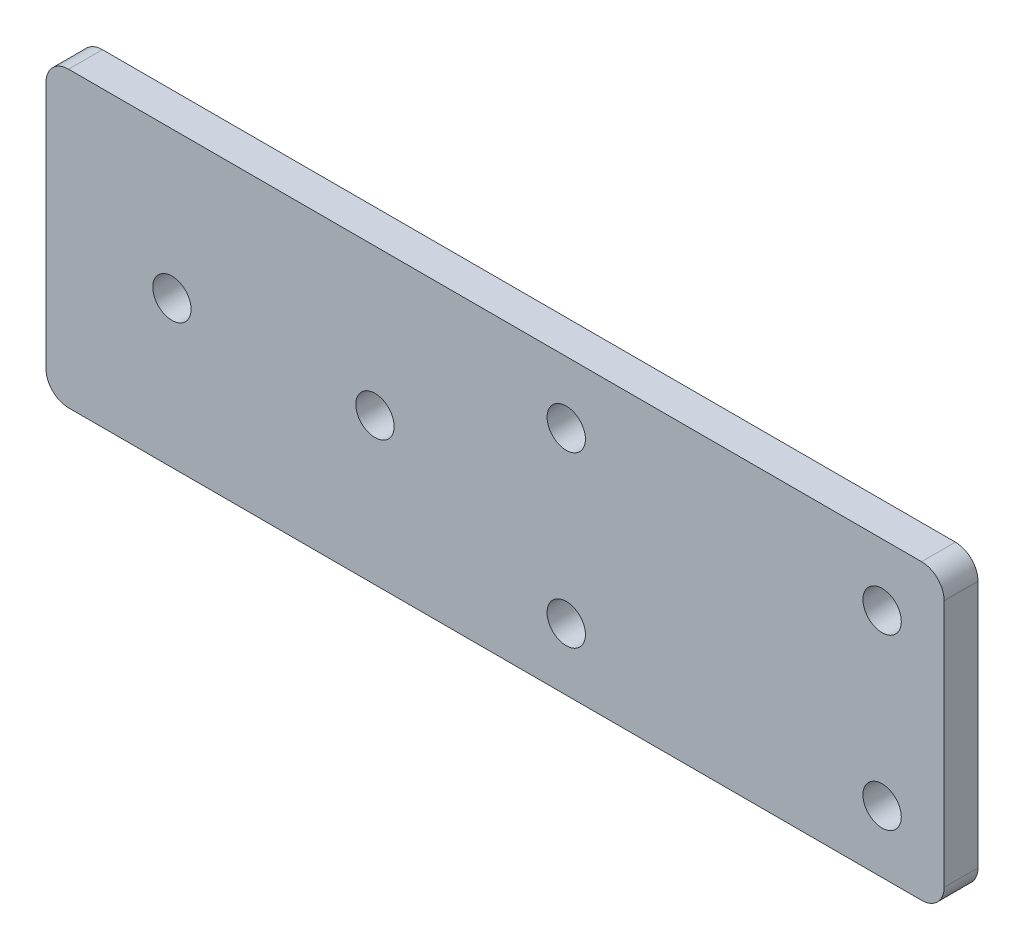
ISO-10303-21;
HEADER;
FILE_DESCRIPTION(('STEP AP214'),'2;1');
FILE_NAME('part.step','',(''),(''),'','','');
FILE_SCHEMA(('AUTOMOTIVE_DESIGN { 1 0 10303 214 1 1 1 1 }'));
ENDSEC;
DATA;
#1=APPLICATION_CONTEXT('core data for automotive mechanical design processes');
#2=APPLICATION_PROTOCOL_DEFINITION('international standard','automotive_design',2000,#1);
#3=PRODUCT_CONTEXT('',#1,'mechanical');
#4=PRODUCT('Part','Part','',(#3));
#5=PRODUCT_RELATED_PRODUCT_CATEGORY('part','',(#4));
#6=PRODUCT_DEFINITION_FORMATION('','',#4);
#7=PRODUCT_DEFINITION_CONTEXT('part definition',#1,'design');
#8=PRODUCT_DEFINITION('design','',#6,#7);
#9=PRODUCT_DEFINITION_SHAPE('','',#8);
#10=(LENGTH_UNIT() NAMED_UNIT(*) SI_UNIT(.MILLI.,.METRE.));
#11=(NAMED_UNIT(*) PLANE_ANGLE_UNIT() SI_UNIT($,.RADIAN.));
#12=(NAMED_UNIT(*) SI_UNIT($,.STERADIAN.) SOLID_ANGLE_UNIT());
#13=UNCERTAINTY_MEASURE_WITH_UNIT(LENGTH_MEASURE(1.E-05),#10,'distance_accuracy_value','');
#14=(GEOMETRIC_REPRESENTATION_CONTEXT(3) GLOBAL_UNCERTAINTY_ASSIGNED_CONTEXT((#13)) GLOBAL_UNIT_ASSIGNED_CONTEXT((#10,
#11,#12)) REPRESENTATION_CONTEXT('',''));
#15=CARTESIAN_POINT('',(0.,0.,0.));
#16=DIRECTION('',(0.,0.,1.));
#17=DIRECTION('',(1.,0.,0.));
#18=AXIS2_PLACEMENT_3D('',#15,#16,#17);
#19=CARTESIAN_POINT('',(297.881741731143,-12.9999999999997,3.));
#20=DIRECTION('',(1.,0.,0.));
#21=DIRECTION('',(0.,0.,-1.));
#22=AXIS2_PLACEMENT_3D('',#19,#20,#21);
#23=PLANE('',#22);
#24=DIRECTION('',(0.,-1.,0.));
#25=VECTOR('',#24,1.);
#26=CARTESIAN_POINT('',(297.881741731143,-12.9999999999997,0.));
#27=LINE('',#26,#25);
#28=CARTESIAN_POINT('',(297.881741731143,11.,0.));
#29=VERTEX_POINT('',#28);
#30=CARTESIAN_POINT('',(297.881741731143,-10.9999999999997,0.));
#31=VERTEX_POINT('',#30);
#32=EDGE_CURVE('E125',#29,#31,#27,.T.);
#33=ORIENTED_EDGE('',*,*,#32,.T.);
#34=DIRECTION('',(0.,0.,-1.));
#35=VECTOR('',#34,1.);
#36=CARTESIAN_POINT('',(297.881741731143,-10.9999999999997,3.));
#37=LINE('',#36,#35);
#38=CARTESIAN_POINT('',(297.881741731143,-10.9999999999997,3.));
#39=VERTEX_POINT('',#38);
#40=EDGE_CURVE('E103',#31,#39,#37,.F.);
#41=ORIENTED_EDGE('',*,*,#40,.T.);
#42=DIRECTION('',(0.,-1.,0.));
#43=VECTOR('',#42,1.);
#44=CARTESIAN_POINT('',(297.881741731143,-12.9999999999997,3.));
#45=LINE('',#44,#43);
#46=CARTESIAN_POINT('',(297.881741731143,11.,3.));
#47=VERTEX_POINT('',#46);
#48=EDGE_CURVE('E135',#47,#39,#45,.T.);
#49=ORIENTED_EDGE('',*,*,#48,.F.);
#50=DIRECTION('',(0.,0.,-1.));
#51=VECTOR('',#50,1.);
#52=CARTESIAN_POINT('',(297.881741731143,11.,3.));
#53=LINE('',#52,#51);
#54=EDGE_CURVE('E108',#47,#29,#53,.T.);
#55=ORIENTED_EDGE('',*,*,#54,.T.);
#56=EDGE_LOOP('',(#33,#41,#49,#55));
#57=FACE_BOUND('',#56,.T.);
#58=ADVANCED_FACE('F32',(#57),#23,.F.);
#59=CARTESIAN_POINT('',(297.881741731143,-12.9999999999997,3.));
#60=DIRECTION('',(0.,1.,0.));
#61=DIRECTION('',(0.,0.,1.));
#62=AXIS2_PLACEMENT_3D('',#59,#60,#61);
#63=PLANE('',#62);
#64=DIRECTION('',(1.,0.,0.));
#65=VECTOR('',#64,1.);
#66=CARTESIAN_POINT('',(297.881741731143,-12.9999999999997,3.));
#67=LINE('',#66,#65);
#68=CARTESIAN_POINT('',(299.881741731143,-12.9999999999997,3.));
#69=VERTEX_POINT('',#68);
#70=CARTESIAN_POINT('',(375.5,-12.9999999999997,3.));
#71=VERTEX_POINT('',#70);
#72=EDGE_CURVE('E118',#69,#71,#67,.T.);
#73=ORIENTED_EDGE('',*,*,#72,.F.);
#74=DIRECTION('',(0.,0.,-1.));
#75=VECTOR('',#74,1.);
#76=CARTESIAN_POINT('',(299.881741731143,-12.9999999999997,3.));
#77=LINE('',#76,#75);
#78=CARTESIAN_POINT('',(299.881741731143,-12.9999999999997,0.));
#79=VERTEX_POINT('',#78);
#80=EDGE_CURVE('E102',#69,#79,#77,.T.);
#81=ORIENTED_EDGE('',*,*,#80,.T.);
#82=DIRECTION('',(1.,0.,0.));
#83=VECTOR('',#82,1.);
#84=CARTESIAN_POINT('',(297.881741731143,-12.9999999999997,0.));
#85=LINE('',#84,#83);
#86=CARTESIAN_POINT('',(375.5,-12.9999999999997,0.));
#87=VERTEX_POINT('',#86);
#88=EDGE_CURVE('E115',#79,#87,#85,.T.);
#89=ORIENTED_EDGE('',*,*,#88,.T.);
#90=DIRECTION('',(0.,0.,-1.));
#91=VECTOR('',#90,1.);
#92=CARTESIAN_POINT('',(375.5,-12.9999999999997,3.));
#93=LINE('',#92,#91);
#94=EDGE_CURVE('E120',#87,#71,#93,.F.);
#95=ORIENTED_EDGE('',*,*,#94,.T.);
#96=EDGE_LOOP('',(#73,#81,#89,#95));
#97=FACE_BOUND('',#96,.T.);
#98=ADVANCED_FACE('F114',(#97),#63,.F.);
#99=CARTESIAN_POINT('',(377.5,-12.9999999999997,3.));
#100=DIRECTION('',(-1.,0.,0.));
#101=DIRECTION('',(0.,0.,1.));
#102=AXIS2_PLACEMENT_3D('',#99,#100,#101);
#103=PLANE('',#102);
#104=DIRECTION('',(0.,1.,0.));
#105=VECTOR('',#104,1.);
#106=CARTESIAN_POINT('',(377.5,-12.9999999999997,0.));
#107=LINE('',#106,#105);
#108=CARTESIAN_POINT('',(377.5,-10.9999999999997,0.));
#109=VERTEX_POINT('',#108);
#110=CARTESIAN_POINT('',(377.5,11.,0.));
#111=VERTEX_POINT('',#110);
#112=EDGE_CURVE('E124',#109,#111,#107,.T.);
#113=ORIENTED_EDGE('',*,*,#112,.T.);
#114=DIRECTION('',(0.,0.,-1.));
#115=VECTOR('',#114,1.);
#116=CARTESIAN_POINT('',(377.5,11.,3.));
#117=LINE('',#116,#115);
#118=CARTESIAN_POINT('',(377.5,11.,3.));
#119=VERTEX_POINT('',#118);
#120=EDGE_CURVE('E11',#111,#119,#117,.F.);
#121=ORIENTED_EDGE('',*,*,#120,.T.);
#122=DIRECTION('',(0.,1.,0.));
#123=VECTOR('',#122,1.);
#124=CARTESIAN_POINT('',(377.5,-12.9999999999997,3.));
#125=LINE('',#124,#123);
#126=CARTESIAN_POINT('',(377.5,-10.9999999999997,3.));
#127=VERTEX_POINT('',#126);
#128=EDGE_CURVE('E174',#127,#119,#125,.T.);
#129=ORIENTED_EDGE('',*,*,#128,.F.);
#130=DIRECTION('',(0.,0.,-1.));
#131=VECTOR('',#130,1.);
#132=CARTESIAN_POINT('',(377.5,-10.9999999999997,3.));
#133=LINE('',#132,#131);
#134=EDGE_CURVE('E40',#127,#109,#133,.T.);
#135=ORIENTED_EDGE('',*,*,#134,.T.);
#136=EDGE_LOOP('',(#113,#121,#129,#135));
#137=FACE_BOUND('',#136,.T.);
#138=ADVANCED_FACE('F172',(#137),#103,.F.);
#139=CARTESIAN_POINT('',(297.881741731143,13.,3.));
#140=DIRECTION('',(0.,-1.,0.));
#141=DIRECTION('',(0.,0.,-1.));
#142=AXIS2_PLACEMENT_3D('',#139,#140,#141);
#143=PLANE('',#142);
#144=DIRECTION('',(-1.,0.,0.));
#145=VECTOR('',#144,1.);
#146=CARTESIAN_POINT('',(297.881741731143,13.,0.));
#147=LINE('',#146,#145);
#148=CARTESIAN_POINT('',(375.5,13.,0.));
#149=VERTEX_POINT('',#148);
#150=CARTESIAN_POINT('',(299.881741731143,13.,0.));
#151=VERTEX_POINT('',#150);
#152=EDGE_CURVE('E128',#149,#151,#147,.T.);
#153=ORIENTED_EDGE('',*,*,#152,.T.);
#154=DIRECTION('',(0.,0.,-1.));
#155=VECTOR('',#154,1.);
#156=CARTESIAN_POINT('',(299.881741731143,13.,3.));
#157=LINE('',#156,#155);
#158=CARTESIAN_POINT('',(299.881741731143,13.,3.));
#159=VERTEX_POINT('',#158);
#160=EDGE_CURVE('E47',#151,#159,#157,.F.);
#161=ORIENTED_EDGE('',*,*,#160,.T.);
#162=DIRECTION('',(-1.,0.,0.));
#163=VECTOR('',#162,1.);
#164=CARTESIAN_POINT('',(297.881741731143,13.,3.));
#165=LINE('',#164,#163);
#166=CARTESIAN_POINT('',(375.5,13.,3.));
#167=VERTEX_POINT('',#166);
#168=EDGE_CURVE('E149',#167,#159,#165,.T.);
#169=ORIENTED_EDGE('',*,*,#168,.F.);
#170=DIRECTION('',(0.,0.,-1.));
#171=VECTOR('',#170,1.);
#172=CARTESIAN_POINT('',(375.5,13.,3.));
#173=LINE('',#172,#171);
#174=EDGE_CURVE('E165',#167,#149,#173,.T.);
#175=ORIENTED_EDGE('',*,*,#174,.T.);
#176=EDGE_LOOP('',(#153,#161,#169,#175));
#177=FACE_BOUND('',#176,.T.);
#178=ADVANCED_FACE('F181',(#177),#143,.F.);
#179=CARTESIAN_POINT('',(0.,0.,3.));
#180=DIRECTION('',(0.,0.,-1.));
#181=DIRECTION('',(-1.,0.,0.));
#182=AXIS2_PLACEMENT_3D('',#179,#180,#181);
#183=PLANE('',#182);
#184=CARTESIAN_POINT('',(309.046054969375,0.,3.));
#185=DIRECTION('',(0.,0.,1.));
#186=DIRECTION('',(1.,0.,0.));
#187=AXIS2_PLACEMENT_3D('',#184,#185,#186);
#188=CIRCLE('',#187,1.69999999999998);
#189=CARTESIAN_POINT('',(310.746054969375,0.,3.));
#190=VERTEX_POINT('',#189);
#191=EDGE_CURVE('E207',#190,#190,#188,.T.);
#192=ORIENTED_EDGE('',*,*,#191,.F.);
#193=EDGE_LOOP('',(#192));
#194=FACE_BOUND('',#193,.T.);
#195=CARTESIAN_POINT('',(327.046054969375,0.,3.));
#196=DIRECTION('',(0.,0.,1.));
#197=DIRECTION('',(1.,0.,0.));
#198=AXIS2_PLACEMENT_3D('',#195,#196,#197);
#199=CIRCLE('',#198,1.69999999999998);
#200=CARTESIAN_POINT('',(328.746054969375,0.,3.));
#201=VERTEX_POINT('',#200);
#202=EDGE_CURVE('E201',#201,#201,#199,.T.);
#203=ORIENTED_EDGE('',*,*,#202,.F.);
#204=EDGE_LOOP('',(#203));
#205=FACE_BOUND('',#204,.T.);
#206=CARTESIAN_POINT('',(372.,-7.50000000000002,3.));
#207=DIRECTION('',(0.,0.,1.));
#208=DIRECTION('',(1.,0.,0.));
#209=AXIS2_PLACEMENT_3D('',#206,#207,#208);
#210=CIRCLE('',#209,1.69999999999998);
#211=CARTESIAN_POINT('',(373.7,-7.50000000000002,3.));
#212=VERTEX_POINT('',#211);
#213=EDGE_CURVE('E148',#212,#212,#210,.T.);
#214=ORIENTED_EDGE('',*,*,#213,.F.);
#215=EDGE_LOOP('',(#214));
#216=FACE_BOUND('',#215,.T.);
#217=CARTESIAN_POINT('',(372.,7.49999999999998,3.));
#218=DIRECTION('',(0.,0.,1.));
#219=DIRECTION('',(1.,0.,0.));
#220=AXIS2_PLACEMENT_3D('',#217,#218,#219);
#221=CIRCLE('',#220,1.69999999999998);
#222=CARTESIAN_POINT('',(373.7,7.49999999999998,3.));
#223=VERTEX_POINT('',#222);
#224=EDGE_CURVE('E144',#223,#223,#221,.T.);
#225=ORIENTED_EDGE('',*,*,#224,.F.);
#226=EDGE_LOOP('',(#225));
#227=FACE_BOUND('',#226,.T.);
#228=CARTESIAN_POINT('',(344.,7.49999999999998,3.));
#229=DIRECTION('',(0.,0.,1.));
#230=DIRECTION('',(1.,0.,0.));
#231=AXIS2_PLACEMENT_3D('',#228,#229,#230);
#232=CIRCLE('',#231,1.69999999999998);
#233=CARTESIAN_POINT('',(345.7,7.49999999999998,3.));
#234=VERTEX_POINT('',#233);
#235=EDGE_CURVE('E140',#234,#234,#232,.T.);
#236=ORIENTED_EDGE('',*,*,#235,.F.);
#237=EDGE_LOOP('',(#236));
#238=FACE_BOUND('',#237,.T.);
#239=CARTESIAN_POINT('',(344.,-7.50000000000002,3.));
#240=DIRECTION('',(0.,0.,1.));
#241=DIRECTION('',(1.,0.,0.));
#242=AXIS2_PLACEMENT_3D('',#239,#240,#241);
#243=CIRCLE('',#242,1.69999999999998);
#244=CARTESIAN_POINT('',(345.7,-7.50000000000002,3.));
#245=VERTEX_POINT('',#244);
#246=EDGE_CURVE('E139',#245,#245,#243,.T.);
#247=ORIENTED_EDGE('',*,*,#246,.F.);
#248=EDGE_LOOP('',(#247));
#249=FACE_BOUND('',#248,.T.);
#250=ORIENTED_EDGE('',*,*,#48,.T.);
#251=CARTESIAN_POINT('',(299.881741731143,-10.9999999999997,3.));
#252=DIRECTION('',(0.,0.,-1.));
#253=DIRECTION('',(-1.,0.,0.));
#254=AXIS2_PLACEMENT_3D('',#251,#252,#253);
#255=CIRCLE('',#254,2.);
#256=EDGE_CURVE('E163',#39,#69,#255,.F.);
#257=ORIENTED_EDGE('',*,*,#256,.T.);
#258=ORIENTED_EDGE('',*,*,#72,.T.);
#259=CARTESIAN_POINT('',(375.5,-10.9999999999997,3.));
#260=DIRECTION('',(0.,0.,-1.));
#261=DIRECTION('',(-1.,0.,0.));
#262=AXIS2_PLACEMENT_3D('',#259,#260,#261);
#263=CIRCLE('',#262,2.);
#264=EDGE_CURVE('E158',#71,#127,#263,.F.);
#265=ORIENTED_EDGE('',*,*,#264,.T.);
#266=ORIENTED_EDGE('',*,*,#128,.T.);
#267=CARTESIAN_POINT('',(375.5,11.,3.));
#268=DIRECTION('',(0.,0.,-1.));
#269=DIRECTION('',(-1.,0.,0.));
#270=AXIS2_PLACEMENT_3D('',#267,#268,#269);
#271=CIRCLE('',#270,2.);
#272=EDGE_CURVE('E54',#119,#167,#271,.F.);
#273=ORIENTED_EDGE('',*,*,#272,.T.);
#274=ORIENTED_EDGE('',*,*,#168,.T.);
#275=CARTESIAN_POINT('',(299.881741731143,11.,3.));
#276=DIRECTION('',(0.,0.,-1.));
#277=DIRECTION('',(-1.,0.,0.));
#278=AXIS2_PLACEMENT_3D('',#275,#276,#277);
#279=CIRCLE('',#278,2.);
#280=EDGE_CURVE('E161',#159,#47,#279,.F.);
#281=ORIENTED_EDGE('',*,*,#280,.T.);
#282=EDGE_LOOP('',(#250,#257,#258,#265,#266,#273,#274,#281));
#283=FACE_BOUND('',#282,.T.);
#284=ADVANCED_FACE('F213',(#194,#205,#216,#227,#238,#249,#283),#183,.F.);
#285=CARTESIAN_POINT('',(0.,0.,0.));
#286=DIRECTION('',(0.,0.,-1.));
#287=DIRECTION('',(-1.,0.,0.));
#288=AXIS2_PLACEMENT_3D('',#285,#286,#287);
#289=PLANE('',#288);
#290=CARTESIAN_POINT('',(309.046054969375,0.,0.));
#291=DIRECTION('',(0.,0.,-1.));
#292=DIRECTION('',(-1.,0.,0.));
#293=AXIS2_PLACEMENT_3D('',#290,#291,#292);
#294=CIRCLE('',#293,1.69999999999998);
#295=CARTESIAN_POINT('',(307.346054969375,0.,0.));
#296=VERTEX_POINT('',#295);
#297=EDGE_CURVE('E204',#296,#296,#294,.T.);
#298=ORIENTED_EDGE('',*,*,#297,.F.);
#299=EDGE_LOOP('',(#298));
#300=FACE_BOUND('',#299,.T.);
#301=CARTESIAN_POINT('',(327.046054969375,0.,0.));
#302=DIRECTION('',(0.,0.,-1.));
#303=DIRECTION('',(-1.,0.,0.));
#304=AXIS2_PLACEMENT_3D('',#301,#302,#303);
#305=CIRCLE('',#304,1.69999999999998);
#306=CARTESIAN_POINT('',(325.346054969375,0.,0.));
#307=VERTEX_POINT('',#306);
#308=EDGE_CURVE('E198',#307,#307,#305,.T.);
#309=ORIENTED_EDGE('',*,*,#308,.F.);
#310=EDGE_LOOP('',(#309));
#311=FACE_BOUND('',#310,.T.);
#312=CARTESIAN_POINT('',(372.,-7.50000000000002,0.));
#313=DIRECTION('',(0.,0.,-1.));
#314=DIRECTION('',(-1.,0.,0.));
#315=AXIS2_PLACEMENT_3D('',#312,#313,#314);
#316=CIRCLE('',#315,1.69999999999998);
#317=CARTESIAN_POINT('',(370.3,-7.50000000000002,0.));
#318=VERTEX_POINT('',#317);
#319=EDGE_CURVE('E145',#318,#318,#316,.T.);
#320=ORIENTED_EDGE('',*,*,#319,.F.);
#321=EDGE_LOOP('',(#320));
#322=FACE_BOUND('',#321,.T.);
#323=CARTESIAN_POINT('',(372.,7.49999999999998,0.));
#324=DIRECTION('',(0.,0.,-1.));
#325=DIRECTION('',(-1.,0.,0.));
#326=AXIS2_PLACEMENT_3D('',#323,#324,#325);
#327=CIRCLE('',#326,1.69999999999998);
#328=CARTESIAN_POINT('',(370.3,7.49999999999998,0.));
#329=VERTEX_POINT('',#328);
#330=EDGE_CURVE('E141',#329,#329,#327,.T.);
#331=ORIENTED_EDGE('',*,*,#330,.F.);
#332=EDGE_LOOP('',(#331));
#333=FACE_BOUND('',#332,.T.);
#334=CARTESIAN_POINT('',(344.,7.49999999999998,0.));
#335=DIRECTION('',(0.,0.,-1.));
#336=DIRECTION('',(-1.,0.,0.));
#337=AXIS2_PLACEMENT_3D('',#334,#335,#336);
#338=CIRCLE('',#337,1.69999999999998);
#339=CARTESIAN_POINT('',(342.3,7.49999999999998,0.));
#340=VERTEX_POINT('',#339);
#341=EDGE_CURVE('E136',#340,#340,#338,.T.);
#342=ORIENTED_EDGE('',*,*,#341,.F.);
#343=EDGE_LOOP('',(#342));
#344=FACE_BOUND('',#343,.T.);
#345=CARTESIAN_POINT('',(344.,-7.50000000000002,0.));
#346=DIRECTION('',(0.,0.,-1.));
#347=DIRECTION('',(-1.,0.,0.));
#348=AXIS2_PLACEMENT_3D('',#345,#346,#347);
#349=CIRCLE('',#348,1.69999999999998);
#350=CARTESIAN_POINT('',(342.3,-7.50000000000002,0.));
#351=VERTEX_POINT('',#350);
#352=EDGE_CURVE('E130',#351,#351,#349,.T.);
#353=ORIENTED_EDGE('',*,*,#352,.F.);
#354=EDGE_LOOP('',(#353));
#355=FACE_BOUND('',#354,.T.);
#356=ORIENTED_EDGE('',*,*,#88,.F.);
#357=CARTESIAN_POINT('',(299.881741731143,-10.9999999999997,0.));
#358=DIRECTION('',(0.,0.,-1.));
#359=DIRECTION('',(-1.,0.,0.));
#360=AXIS2_PLACEMENT_3D('',#357,#358,#359);
#361=CIRCLE('',#360,2.);
#362=EDGE_CURVE('E98',#79,#31,#361,.T.);
#363=ORIENTED_EDGE('',*,*,#362,.T.);
#364=ORIENTED_EDGE('',*,*,#32,.F.);
#365=CARTESIAN_POINT('',(299.881741731143,11.,0.));
#366=DIRECTION('',(0.,0.,-1.));
#367=DIRECTION('',(-1.,0.,0.));
#368=AXIS2_PLACEMENT_3D('',#365,#366,#367);
#369=CIRCLE('',#368,2.);
#370=EDGE_CURVE('E109',#29,#151,#369,.T.);
#371=ORIENTED_EDGE('',*,*,#370,.T.);
#372=ORIENTED_EDGE('',*,*,#152,.F.);
#373=CARTESIAN_POINT('',(375.5,11.,0.));
#374=DIRECTION('',(0.,0.,-1.));
#375=DIRECTION('',(-1.,0.,0.));
#376=AXIS2_PLACEMENT_3D('',#373,#374,#375);
#377=CIRCLE('',#376,2.);
#378=EDGE_CURVE('E152',#149,#111,#377,.T.);
#379=ORIENTED_EDGE('',*,*,#378,.T.);
#380=ORIENTED_EDGE('',*,*,#112,.F.);
#381=CARTESIAN_POINT('',(375.5,-10.9999999999997,0.));
#382=DIRECTION('',(0.,0.,-1.));
#383=DIRECTION('',(-1.,0.,0.));
#384=AXIS2_PLACEMENT_3D('',#381,#382,#383);
#385=CIRCLE('',#384,2.);
#386=EDGE_CURVE('E119',#109,#87,#385,.T.);
#387=ORIENTED_EDGE('',*,*,#386,.T.);
#388=EDGE_LOOP('',(#356,#363,#364,#371,#372,#379,#380,#387));
#389=FACE_BOUND('',#388,.T.);
#390=ADVANCED_FACE('F122',(#300,#311,#322,#333,#344,#355,#389),#289,.T.);
#391=CARTESIAN_POINT('',(344.,-7.50000000000002,3.));
#392=DIRECTION('',(0.,0.,1.));
#393=DIRECTION('',(1.,0.,0.));
#394=AXIS2_PLACEMENT_3D('',#391,#392,#393);
#395=CYLINDRICAL_SURFACE('',#394,1.69999999999998);
#396=ORIENTED_EDGE('',*,*,#352,.T.);
#397=EDGE_LOOP('',(#396));
#398=FACE_BOUND('',#397,.T.);
#399=ORIENTED_EDGE('',*,*,#246,.T.);
#400=EDGE_LOOP('',(#399));
#401=FACE_BOUND('',#400,.T.);
#402=ADVANCED_FACE('F250',(#398,#401),#395,.F.);
#403=CARTESIAN_POINT('',(344.,7.49999999999998,3.));
#404=DIRECTION('',(0.,0.,1.));
#405=DIRECTION('',(1.,0.,0.));
#406=AXIS2_PLACEMENT_3D('',#403,#404,#405);
#407=CYLINDRICAL_SURFACE('',#406,1.69999999999998);
#408=ORIENTED_EDGE('',*,*,#341,.T.);
#409=EDGE_LOOP('',(#408));
#410=FACE_BOUND('',#409,.T.);
#411=ORIENTED_EDGE('',*,*,#235,.T.);
#412=EDGE_LOOP('',(#411));
#413=FACE_BOUND('',#412,.T.);
#414=ADVANCED_FACE('F255',(#410,#413),#407,.F.);
#415=CARTESIAN_POINT('',(372.,7.49999999999998,3.));
#416=DIRECTION('',(0.,0.,1.));
#417=DIRECTION('',(1.,0.,0.));
#418=AXIS2_PLACEMENT_3D('',#415,#416,#417);
#419=CYLINDRICAL_SURFACE('',#418,1.69999999999998);
#420=ORIENTED_EDGE('',*,*,#330,.T.);
#421=EDGE_LOOP('',(#420));
#422=FACE_BOUND('',#421,.T.);
#423=ORIENTED_EDGE('',*,*,#224,.T.);
#424=EDGE_LOOP('',(#423));
#425=FACE_BOUND('',#424,.T.);
#426=ADVANCED_FACE('F259',(#422,#425),#419,.F.);
#427=CARTESIAN_POINT('',(372.,-7.50000000000002,3.));
#428=DIRECTION('',(0.,0.,1.));
#429=DIRECTION('',(1.,0.,0.));
#430=AXIS2_PLACEMENT_3D('',#427,#428,#429);
#431=CYLINDRICAL_SURFACE('',#430,1.69999999999998);
#432=ORIENTED_EDGE('',*,*,#319,.T.);
#433=EDGE_LOOP('',(#432));
#434=FACE_BOUND('',#433,.T.);
#435=ORIENTED_EDGE('',*,*,#213,.T.);
#436=EDGE_LOOP('',(#435));
#437=FACE_BOUND('',#436,.T.);
#438=ADVANCED_FACE('F263',(#434,#437),#431,.F.);
#439=CARTESIAN_POINT('',(327.046054969375,0.,3.));
#440=DIRECTION('',(0.,0.,1.));
#441=DIRECTION('',(1.,0.,0.));
#442=AXIS2_PLACEMENT_3D('',#439,#440,#441);
#443=CYLINDRICAL_SURFACE('',#442,1.69999999999998);
#444=ORIENTED_EDGE('',*,*,#308,.T.);
#445=EDGE_LOOP('',(#444));
#446=FACE_BOUND('',#445,.T.);
#447=ORIENTED_EDGE('',*,*,#202,.T.);
#448=EDGE_LOOP('',(#447));
#449=FACE_BOUND('',#448,.T.);
#450=ADVANCED_FACE('F267',(#446,#449),#443,.F.);
#451=CARTESIAN_POINT('',(309.046054969375,0.,3.));
#452=DIRECTION('',(0.,0.,1.));
#453=DIRECTION('',(1.,0.,0.));
#454=AXIS2_PLACEMENT_3D('',#451,#452,#453);
#455=CYLINDRICAL_SURFACE('',#454,1.69999999999998);
#456=ORIENTED_EDGE('',*,*,#297,.T.);
#457=EDGE_LOOP('',(#456));
#458=FACE_BOUND('',#457,.T.);
#459=ORIENTED_EDGE('',*,*,#191,.T.);
#460=EDGE_LOOP('',(#459));
#461=FACE_BOUND('',#460,.T.);
#462=ADVANCED_FACE('F211',(#458,#461),#455,.F.);
#463=CARTESIAN_POINT('',(299.881741731143,-10.9999999999997,3.));
#464=DIRECTION('',(0.,0.,-1.));
#465=DIRECTION('',(-1.,0.,0.));
#466=AXIS2_PLACEMENT_3D('',#463,#464,#465);
#467=CYLINDRICAL_SURFACE('',#466,2.);
#468=ORIENTED_EDGE('',*,*,#256,.F.);
#469=ORIENTED_EDGE('',*,*,#40,.F.);
#470=ORIENTED_EDGE('',*,*,#362,.F.);
#471=ORIENTED_EDGE('',*,*,#80,.F.);
#472=EDGE_LOOP('',(#468,#469,#470,#471));
#473=FACE_BOUND('',#472,.T.);
#474=ADVANCED_FACE('F101',(#473),#467,.T.);
#475=CARTESIAN_POINT('',(299.881741731143,11.,3.));
#476=DIRECTION('',(0.,0.,-1.));
#477=DIRECTION('',(-1.,0.,0.));
#478=AXIS2_PLACEMENT_3D('',#475,#476,#477);
#479=CYLINDRICAL_SURFACE('',#478,2.);
#480=ORIENTED_EDGE('',*,*,#280,.F.);
#481=ORIENTED_EDGE('',*,*,#160,.F.);
#482=ORIENTED_EDGE('',*,*,#370,.F.);
#483=ORIENTED_EDGE('',*,*,#54,.F.);
#484=EDGE_LOOP('',(#480,#481,#482,#483));
#485=FACE_BOUND('',#484,.T.);
#486=ADVANCED_FACE('F230',(#485),#479,.T.);
#487=CARTESIAN_POINT('',(375.5,11.,3.));
#488=DIRECTION('',(0.,0.,-1.));
#489=DIRECTION('',(-1.,0.,0.));
#490=AXIS2_PLACEMENT_3D('',#487,#488,#489);
#491=CYLINDRICAL_SURFACE('',#490,2.);
#492=ORIENTED_EDGE('',*,*,#272,.F.);
#493=ORIENTED_EDGE('',*,*,#120,.F.);
#494=ORIENTED_EDGE('',*,*,#378,.F.);
#495=ORIENTED_EDGE('',*,*,#174,.F.);
#496=EDGE_LOOP('',(#492,#493,#494,#495));
#497=FACE_BOUND('',#496,.T.);
#498=ADVANCED_FACE('F180',(#497),#491,.T.);
#499=CARTESIAN_POINT('',(375.5,-10.9999999999997,3.));
#500=DIRECTION('',(0.,0.,-1.));
#501=DIRECTION('',(-1.,0.,0.));
#502=AXIS2_PLACEMENT_3D('',#499,#500,#501);
#503=CYLINDRICAL_SURFACE('',#502,2.);
#504=ORIENTED_EDGE('',*,*,#264,.F.);
#505=ORIENTED_EDGE('',*,*,#94,.F.);
#506=ORIENTED_EDGE('',*,*,#386,.F.);
#507=ORIENTED_EDGE('',*,*,#134,.F.);
#508=EDGE_LOOP('',(#504,#505,#506,#507));
#509=FACE_BOUND('',#508,.T.);
#510=ADVANCED_FACE('F34',(#509),#503,.T.);
#511=CLOSED_SHELL('',(#58,#98,#138,#178,#284,#390,#402,#414,#426,#438,#450,#462,#474,#486,#498,#510));
#512=MANIFOLD_SOLID_BREP('B2',#511);
#513=ADVANCED_BREP_SHAPE_REPRESENTATION('',(#18,#512),#14);
#514=SHAPE_DEFINITION_REPRESENTATION(#9,#513);
ENDSEC;
END-ISO-10303-21;
